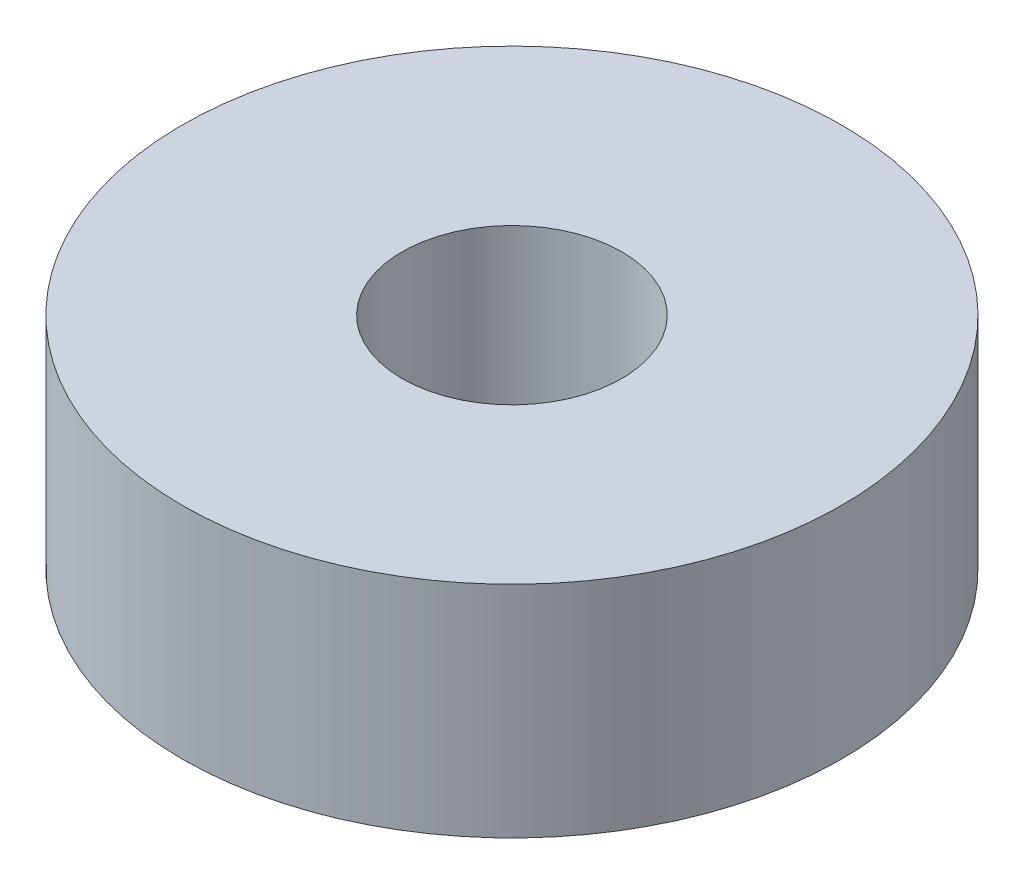
ISO-10303-21;
HEADER;
FILE_DESCRIPTION(('STEP AP214'),'2;1');
FILE_NAME('part.step','',(''),(''),'','','');
FILE_SCHEMA(('AUTOMOTIVE_DESIGN { 1 0 10303 214 1 1 1 1 }'));
ENDSEC;
DATA;
#1=APPLICATION_CONTEXT('core data for automotive mechanical design processes');
#2=APPLICATION_PROTOCOL_DEFINITION('international standard','automotive_design',2000,#1);
#3=PRODUCT_CONTEXT('',#1,'mechanical');
#4=PRODUCT('Part','Part','',(#3));
#5=PRODUCT_RELATED_PRODUCT_CATEGORY('part','',(#4));
#6=PRODUCT_DEFINITION_FORMATION('','',#4);
#7=PRODUCT_DEFINITION_CONTEXT('part definition',#1,'design');
#8=PRODUCT_DEFINITION('design','',#6,#7);
#9=PRODUCT_DEFINITION_SHAPE('','',#8);
#10=(LENGTH_UNIT() NAMED_UNIT(*) SI_UNIT(.MILLI.,.METRE.));
#11=(NAMED_UNIT(*) PLANE_ANGLE_UNIT() SI_UNIT($,.RADIAN.));
#12=(NAMED_UNIT(*) SI_UNIT($,.STERADIAN.) SOLID_ANGLE_UNIT());
#13=UNCERTAINTY_MEASURE_WITH_UNIT(LENGTH_MEASURE(1.E-05),#10,'distance_accuracy_value','');
#14=(GEOMETRIC_REPRESENTATION_CONTEXT(3) GLOBAL_UNCERTAINTY_ASSIGNED_CONTEXT((#13)) GLOBAL_UNIT_ASSIGNED_CONTEXT((#10,
#11,#12)) REPRESENTATION_CONTEXT('',''));
#15=CARTESIAN_POINT('',(0.,0.,0.));
#16=DIRECTION('',(0.,0.,1.));
#17=DIRECTION('',(1.,0.,0.));
#18=AXIS2_PLACEMENT_3D('',#15,#16,#17);
#19=CARTESIAN_POINT('',(8.37721983593553,4.,0.));
#20=DIRECTION('',(0.,1.,0.));
#21=DIRECTION('',(0.,0.,1.));
#22=AXIS2_PLACEMENT_3D('',#19,#20,#21);
#23=PLANE('',#22);
#24=CARTESIAN_POINT('',(8.37721983593553,4.,0.));
#25=DIRECTION('',(0.,1.,0.));
#26=DIRECTION('',(0.,0.,1.));
#27=AXIS2_PLACEMENT_3D('',#24,#25,#26);
#28=CIRCLE('',#27,6.);
#29=CARTESIAN_POINT('',(8.37721983593553,4.,6.));
#30=VERTEX_POINT('',#29);
#31=EDGE_CURVE('E10',#30,#30,#28,.T.);
#32=ORIENTED_EDGE('',*,*,#31,.T.);
#33=EDGE_LOOP('',(#32));
#34=FACE_BOUND('',#33,.T.);
#35=CARTESIAN_POINT('',(8.37721983593553,4.,0.));
#36=DIRECTION('',(0.,1.,0.));
#37=DIRECTION('',(0.,0.,1.));
#38=AXIS2_PLACEMENT_3D('',#35,#36,#37);
#39=CIRCLE('',#38,2.);
#40=CARTESIAN_POINT('',(8.37721983593553,4.,2.));
#41=VERTEX_POINT('',#40);
#42=EDGE_CURVE('E52',#41,#41,#39,.T.);
#43=ORIENTED_EDGE('',*,*,#42,.F.);
#44=EDGE_LOOP('',(#43));
#45=FACE_BOUND('',#44,.T.);
#46=ADVANCED_FACE('F39',(#34,#45),#23,.T.);
#47=CARTESIAN_POINT('',(8.37721983593553,0.,0.));
#48=DIRECTION('',(0.,1.,0.));
#49=DIRECTION('',(0.,0.,1.));
#50=AXIS2_PLACEMENT_3D('',#47,#48,#49);
#51=PLANE('',#50);
#52=CARTESIAN_POINT('',(8.37721983593553,0.,0.));
#53=DIRECTION('',(0.,1.,0.));
#54=DIRECTION('',(0.,0.,1.));
#55=AXIS2_PLACEMENT_3D('',#52,#53,#54);
#56=CIRCLE('',#55,6.);
#57=CARTESIAN_POINT('',(8.37721983593553,0.,6.));
#58=VERTEX_POINT('',#57);
#59=EDGE_CURVE('E43',#58,#58,#56,.T.);
#60=ORIENTED_EDGE('',*,*,#59,.F.);
#61=EDGE_LOOP('',(#60));
#62=FACE_BOUND('',#61,.T.);
#63=CARTESIAN_POINT('',(8.37721983593553,0.,0.));
#64=DIRECTION('',(0.,1.,0.));
#65=DIRECTION('',(0.,0.,1.));
#66=AXIS2_PLACEMENT_3D('',#63,#64,#65);
#67=CIRCLE('',#66,2.);
#68=CARTESIAN_POINT('',(8.37721983593553,0.,2.));
#69=VERTEX_POINT('',#68);
#70=EDGE_CURVE('E54',#69,#69,#67,.T.);
#71=ORIENTED_EDGE('',*,*,#70,.T.);
#72=EDGE_LOOP('',(#71));
#73=FACE_BOUND('',#72,.T.);
#74=ADVANCED_FACE('F66',(#62,#73),#51,.F.);
#75=CARTESIAN_POINT('',(8.37721983593553,4.,0.));
#76=DIRECTION('',(0.,-1.,0.));
#77=DIRECTION('',(0.,0.,-1.));
#78=AXIS2_PLACEMENT_3D('',#75,#76,#77);
#79=CYLINDRICAL_SURFACE('',#78,6.);
#80=ORIENTED_EDGE('',*,*,#31,.F.);
#81=EDGE_LOOP('',(#80));
#82=FACE_BOUND('',#81,.T.);
#83=ORIENTED_EDGE('',*,*,#59,.T.);
#84=EDGE_LOOP('',(#83));
#85=FACE_BOUND('',#84,.T.);
#86=ADVANCED_FACE('F41',(#82,#85),#79,.T.);
#87=CARTESIAN_POINT('',(8.37721983593553,4.,0.));
#88=DIRECTION('',(0.,-1.,0.));
#89=DIRECTION('',(0.,0.,-1.));
#90=AXIS2_PLACEMENT_3D('',#87,#88,#89);
#91=CYLINDRICAL_SURFACE('',#90,2.);
#92=ORIENTED_EDGE('',*,*,#42,.T.);
#93=EDGE_LOOP('',(#92));
#94=FACE_BOUND('',#93,.T.);
#95=ORIENTED_EDGE('',*,*,#70,.F.);
#96=EDGE_LOOP('',(#95));
#97=FACE_BOUND('',#96,.T.);
#98=ADVANCED_FACE('F62',(#94,#97),#91,.F.);
#99=CLOSED_SHELL('',(#46,#74,#86,#98));
#100=MANIFOLD_SOLID_BREP('B2',#99);
#101=ADVANCED_BREP_SHAPE_REPRESENTATION('',(#18,#100),#14);
#102=SHAPE_DEFINITION_REPRESENTATION(#9,#101);
ENDSEC;
END-ISO-10303-21;
